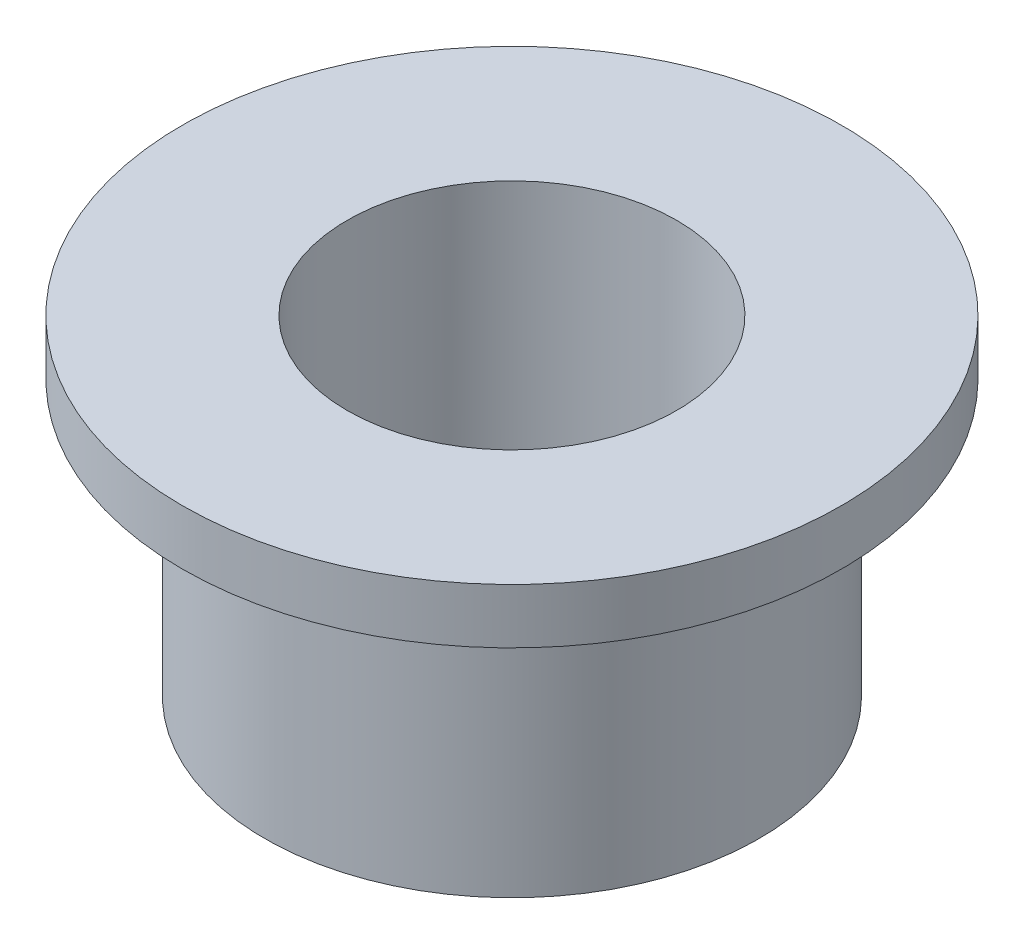
ISO-10303-21;
HEADER;
FILE_DESCRIPTION(('STEP AP214'),'2;1');
FILE_NAME('part.step','',(''),(''),'','','');
FILE_SCHEMA(('AUTOMOTIVE_DESIGN { 1 0 10303 214 1 1 1 1 }'));
ENDSEC;
DATA;
#1=APPLICATION_CONTEXT('core data for automotive mechanical design processes');
#2=APPLICATION_PROTOCOL_DEFINITION('international standard','automotive_design',2000,#1);
#3=PRODUCT_CONTEXT('',#1,'mechanical');
#4=PRODUCT('Part','Part','',(#3));
#5=PRODUCT_RELATED_PRODUCT_CATEGORY('part','',(#4));
#6=PRODUCT_DEFINITION_FORMATION('','',#4);
#7=PRODUCT_DEFINITION_CONTEXT('part definition',#1,'design');
#8=PRODUCT_DEFINITION('design','',#6,#7);
#9=PRODUCT_DEFINITION_SHAPE('','',#8);
#10=(LENGTH_UNIT() NAMED_UNIT(*) SI_UNIT(.MILLI.,.METRE.));
#11=(NAMED_UNIT(*) PLANE_ANGLE_UNIT() SI_UNIT($,.RADIAN.));
#12=(NAMED_UNIT(*) SI_UNIT($,.STERADIAN.) SOLID_ANGLE_UNIT());
#13=UNCERTAINTY_MEASURE_WITH_UNIT(LENGTH_MEASURE(1.E-05),#10,'distance_accuracy_value','');
#14=(GEOMETRIC_REPRESENTATION_CONTEXT(3) GLOBAL_UNCERTAINTY_ASSIGNED_CONTEXT((#13)) GLOBAL_UNIT_ASSIGNED_CONTEXT((#10,
#11,#12)) REPRESENTATION_CONTEXT('',''));
#15=CARTESIAN_POINT('',(0.,0.,0.));
#16=DIRECTION('',(0.,0.,1.));
#17=DIRECTION('',(1.,0.,0.));
#18=AXIS2_PLACEMENT_3D('',#15,#16,#17);
#19=CARTESIAN_POINT('',(0.,1.,0.));
#20=DIRECTION('',(0.,1.,0.));
#21=DIRECTION('',(0.,0.,1.));
#22=AXIS2_PLACEMENT_3D('',#19,#20,#21);
#23=PLANE('',#22);
#24=CARTESIAN_POINT('',(0.,1.,0.));
#25=DIRECTION('',(0.,1.,0.));
#26=DIRECTION('',(0.,0.,1.));
#27=AXIS2_PLACEMENT_3D('',#24,#25,#26);
#28=CIRCLE('',#27,6.);
#29=CARTESIAN_POINT('',(0.,1.,6.));
#30=VERTEX_POINT('',#29);
#31=EDGE_CURVE('E55',#30,#30,#28,.T.);
#32=ORIENTED_EDGE('',*,*,#31,.T.);
#33=EDGE_LOOP('',(#32));
#34=FACE_BOUND('',#33,.T.);
#35=CARTESIAN_POINT('',(0.,1.,0.));
#36=DIRECTION('',(0.,1.,0.));
#37=DIRECTION('',(0.,0.,1.));
#38=AXIS2_PLACEMENT_3D('',#35,#36,#37);
#39=CIRCLE('',#38,3.);
#40=CARTESIAN_POINT('',(0.,1.,3.));
#41=VERTEX_POINT('',#40);
#42=EDGE_CURVE('E64',#41,#41,#39,.T.);
#43=ORIENTED_EDGE('',*,*,#42,.F.);
#44=EDGE_LOOP('',(#43));
#45=FACE_BOUND('',#44,.T.);
#46=ADVANCED_FACE('F43',(#34,#45),#23,.T.);
#47=CARTESIAN_POINT('',(0.,0.,0.));
#48=DIRECTION('',(0.,1.,0.));
#49=DIRECTION('',(0.,0.,1.));
#50=AXIS2_PLACEMENT_3D('',#47,#48,#49);
#51=PLANE('',#50);
#52=CARTESIAN_POINT('',(0.,0.,0.));
#53=DIRECTION('',(0.,-1.,0.));
#54=DIRECTION('',(0.,0.,-1.));
#55=AXIS2_PLACEMENT_3D('',#52,#53,#54);
#56=CIRCLE('',#55,4.5);
#57=CARTESIAN_POINT('',(0.,0.,-4.5));
#58=VERTEX_POINT('',#57);
#59=EDGE_CURVE('E10',#58,#58,#56,.T.);
#60=ORIENTED_EDGE('',*,*,#59,.F.);
#61=EDGE_LOOP('',(#60));
#62=FACE_BOUND('',#61,.T.);
#63=CARTESIAN_POINT('',(0.,0.,0.));
#64=DIRECTION('',(0.,1.,0.));
#65=DIRECTION('',(0.,0.,1.));
#66=AXIS2_PLACEMENT_3D('',#63,#64,#65);
#67=CIRCLE('',#66,6.);
#68=CARTESIAN_POINT('',(0.,0.,6.));
#69=VERTEX_POINT('',#68);
#70=EDGE_CURVE('E50',#69,#69,#67,.T.);
#71=ORIENTED_EDGE('',*,*,#70,.F.);
#72=EDGE_LOOP('',(#71));
#73=FACE_BOUND('',#72,.T.);
#74=ADVANCED_FACE('F95',(#62,#73),#51,.F.);
#75=CARTESIAN_POINT('',(0.,1.,0.));
#76=DIRECTION('',(0.,-1.,0.));
#77=DIRECTION('',(0.,0.,-1.));
#78=AXIS2_PLACEMENT_3D('',#75,#76,#77);
#79=CYLINDRICAL_SURFACE('',#78,6.);
#80=ORIENTED_EDGE('',*,*,#31,.F.);
#81=EDGE_LOOP('',(#80));
#82=FACE_BOUND('',#81,.T.);
#83=ORIENTED_EDGE('',*,*,#70,.T.);
#84=EDGE_LOOP('',(#83));
#85=FACE_BOUND('',#84,.T.);
#86=ADVANCED_FACE('F44',(#82,#85),#79,.T.);
#87=CARTESIAN_POINT('',(0.,1.,0.));
#88=DIRECTION('',(0.,-1.,0.));
#89=DIRECTION('',(0.,0.,-1.));
#90=AXIS2_PLACEMENT_3D('',#87,#88,#89);
#91=CYLINDRICAL_SURFACE('',#90,3.);
#92=ORIENTED_EDGE('',*,*,#42,.T.);
#93=EDGE_LOOP('',(#92));
#94=FACE_BOUND('',#93,.T.);
#95=CARTESIAN_POINT('',(0.,-5.,0.));
#96=DIRECTION('',(0.,-1.,0.));
#97=DIRECTION('',(0.,0.,-1.));
#98=AXIS2_PLACEMENT_3D('',#95,#96,#97);
#99=CIRCLE('',#98,3.);
#100=CARTESIAN_POINT('',(0.,-5.,-3.));
#101=VERTEX_POINT('',#100);
#102=EDGE_CURVE('E72',#101,#101,#99,.T.);
#103=ORIENTED_EDGE('',*,*,#102,.T.);
#104=EDGE_LOOP('',(#103));
#105=FACE_BOUND('',#104,.T.);
#106=ADVANCED_FACE('F76',(#94,#105),#91,.F.);
#107=CARTESIAN_POINT('',(0.,-5.,0.));
#108=DIRECTION('',(0.,-1.,0.));
#109=DIRECTION('',(0.,0.,-1.));
#110=AXIS2_PLACEMENT_3D('',#107,#108,#109);
#111=PLANE('',#110);
#112=CARTESIAN_POINT('',(0.,-5.,0.));
#113=DIRECTION('',(0.,-1.,0.));
#114=DIRECTION('',(0.,0.,-1.));
#115=AXIS2_PLACEMENT_3D('',#112,#113,#114);
#116=CIRCLE('',#115,4.5);
#117=CARTESIAN_POINT('',(0.,-5.,-4.5));
#118=VERTEX_POINT('',#117);
#119=EDGE_CURVE('E58',#118,#118,#116,.T.);
#120=ORIENTED_EDGE('',*,*,#119,.T.);
#121=EDGE_LOOP('',(#120));
#122=FACE_BOUND('',#121,.T.);
#123=ORIENTED_EDGE('',*,*,#102,.F.);
#124=EDGE_LOOP('',(#123));
#125=FACE_BOUND('',#124,.T.);
#126=ADVANCED_FACE('F79',(#122,#125),#111,.T.);
#127=CARTESIAN_POINT('',(0.,-5.,0.));
#128=DIRECTION('',(0.,1.,0.));
#129=DIRECTION('',(0.,0.,1.));
#130=AXIS2_PLACEMENT_3D('',#127,#128,#129);
#131=CYLINDRICAL_SURFACE('',#130,4.5);
#132=ORIENTED_EDGE('',*,*,#119,.F.);
#133=EDGE_LOOP('',(#132));
#134=FACE_BOUND('',#133,.T.);
#135=ORIENTED_EDGE('',*,*,#59,.T.);
#136=EDGE_LOOP('',(#135));
#137=FACE_BOUND('',#136,.T.);
#138=ADVANCED_FACE('F85',(#134,#137),#131,.T.);
#139=CLOSED_SHELL('',(#46,#74,#86,#106,#126,#138));
#140=MANIFOLD_SOLID_BREP('B2',#139);
#141=ADVANCED_BREP_SHAPE_REPRESENTATION('',(#18,#140),#14);
#142=SHAPE_DEFINITION_REPRESENTATION(#9,#141);
ENDSEC;
END-ISO-10303-21;
